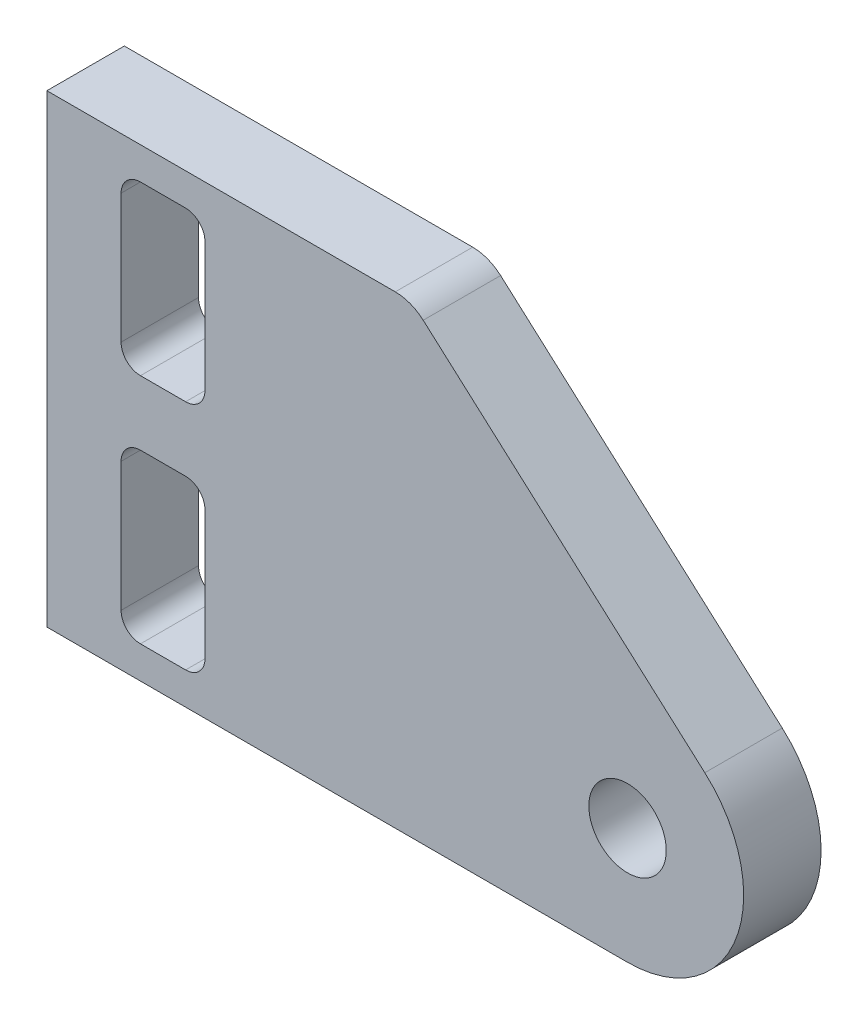
ISO-10303-21;
HEADER;
FILE_DESCRIPTION(('STEP AP214'),'2;1');
FILE_NAME('part.step','',(''),(''),'','','');
FILE_SCHEMA(('AUTOMOTIVE_DESIGN { 1 0 10303 214 1 1 1 1 }'));
ENDSEC;
DATA;
#1=APPLICATION_CONTEXT('core data for automotive mechanical design processes');
#2=APPLICATION_PROTOCOL_DEFINITION('international standard','automotive_design',2000,#1);
#3=PRODUCT_CONTEXT('',#1,'mechanical');
#4=PRODUCT('Part','Part','',(#3));
#5=PRODUCT_RELATED_PRODUCT_CATEGORY('part','',(#4));
#6=PRODUCT_DEFINITION_FORMATION('','',#4);
#7=PRODUCT_DEFINITION_CONTEXT('part definition',#1,'design');
#8=PRODUCT_DEFINITION('design','',#6,#7);
#9=PRODUCT_DEFINITION_SHAPE('','',#8);
#10=(LENGTH_UNIT() NAMED_UNIT(*) SI_UNIT(.MILLI.,.METRE.));
#11=(NAMED_UNIT(*) PLANE_ANGLE_UNIT() SI_UNIT($,.RADIAN.));
#12=(NAMED_UNIT(*) SI_UNIT($,.STERADIAN.) SOLID_ANGLE_UNIT());
#13=UNCERTAINTY_MEASURE_WITH_UNIT(LENGTH_MEASURE(1.E-05),#10,'distance_accuracy_value','');
#14=(GEOMETRIC_REPRESENTATION_CONTEXT(3) GLOBAL_UNCERTAINTY_ASSIGNED_CONTEXT((#13)) GLOBAL_UNIT_ASSIGNED_CONTEXT((#10,
#11,#12)) REPRESENTATION_CONTEXT('',''));
#15=CARTESIAN_POINT('',(0.,0.,0.));
#16=DIRECTION('',(0.,0.,1.));
#17=DIRECTION('',(1.,0.,0.));
#18=AXIS2_PLACEMENT_3D('',#15,#16,#17);
#19=CARTESIAN_POINT('',(201.097853309265,269.1465473352,3.));
#20=DIRECTION('',(0.,0.,1.));
#21=DIRECTION('',(1.,0.,0.));
#22=AXIS2_PLACEMENT_3D('',#19,#20,#21);
#23=PLANE('',#22);
#24=DIRECTION('',(1.,0.,0.));
#25=VECTOR('',#24,1.);
#26=CARTESIAN_POINT('',(182.2228533093,265.8965473352,3.));
#27=LINE('',#26,#25);
#28=CARTESIAN_POINT('',(182.2228533093,265.8965473352,3.));
#29=VERTEX_POINT('',#28);
#30=CARTESIAN_POINT('',(183.9728533093,265.8965473352,3.));
#31=VERTEX_POINT('',#30);
#32=EDGE_CURVE('E249',#29,#31,#27,.T.);
#33=ORIENTED_EDGE('',*,*,#32,.F.);
#34=CARTESIAN_POINT('',(182.2228533093,266.6465473352,3.));
#35=DIRECTION('',(0.,0.,1.));
#36=DIRECTION('',(1.,0.,0.));
#37=AXIS2_PLACEMENT_3D('',#34,#35,#36);
#38=CIRCLE('',#37,0.749999999999987);
#39=CARTESIAN_POINT('',(181.4728533093,266.6465473352,3.));
#40=VERTEX_POINT('',#39);
#41=EDGE_CURVE('E247',#40,#29,#38,.T.);
#42=ORIENTED_EDGE('',*,*,#41,.F.);
#43=DIRECTION('',(0.,-1.,0.));
#44=VECTOR('',#43,1.);
#45=CARTESIAN_POINT('',(181.4728533093,271.6465473352,3.));
#46=LINE('',#45,#44);
#47=CARTESIAN_POINT('',(181.4728533093,271.6465473352,3.));
#48=VERTEX_POINT('',#47);
#49=EDGE_CURVE('E263',#48,#40,#46,.T.);
#50=ORIENTED_EDGE('',*,*,#49,.F.);
#51=CARTESIAN_POINT('',(182.2228533093,271.6465473352,3.));
#52=DIRECTION('',(0.,0.,1.));
#53=DIRECTION('',(1.,0.,0.));
#54=AXIS2_PLACEMENT_3D('',#51,#52,#53);
#55=CIRCLE('',#54,0.750000000000015);
#56=CARTESIAN_POINT('',(182.2228533093,272.3965473352,3.));
#57=VERTEX_POINT('',#56);
#58=EDGE_CURVE('E260',#57,#48,#55,.T.);
#59=ORIENTED_EDGE('',*,*,#58,.F.);
#60=DIRECTION('',(-1.,0.,0.));
#61=VECTOR('',#60,1.);
#62=CARTESIAN_POINT('',(183.9728533093,272.3965473352,3.));
#63=LINE('',#62,#61);
#64=CARTESIAN_POINT('',(183.9728533093,272.3965473352,3.));
#65=VERTEX_POINT('',#64);
#66=EDGE_CURVE('E258',#65,#57,#63,.T.);
#67=ORIENTED_EDGE('',*,*,#66,.F.);
#68=CARTESIAN_POINT('',(183.9728533093,271.6465473352,3.));
#69=DIRECTION('',(0.,0.,1.));
#70=DIRECTION('',(1.,0.,0.));
#71=AXIS2_PLACEMENT_3D('',#68,#69,#70);
#72=CIRCLE('',#71,0.750000000000015);
#73=CARTESIAN_POINT('',(184.7228533093,271.6465473352,3.));
#74=VERTEX_POINT('',#73);
#75=EDGE_CURVE('E256',#74,#65,#72,.T.);
#76=ORIENTED_EDGE('',*,*,#75,.F.);
#77=DIRECTION('',(0.,1.,0.));
#78=VECTOR('',#77,1.);
#79=CARTESIAN_POINT('',(184.7228533093,266.6465473352,3.));
#80=LINE('',#79,#78);
#81=CARTESIAN_POINT('',(184.7228533093,266.6465473352,3.));
#82=VERTEX_POINT('',#81);
#83=EDGE_CURVE('E254',#82,#74,#80,.T.);
#84=ORIENTED_EDGE('',*,*,#83,.F.);
#85=CARTESIAN_POINT('',(183.9728533093,266.6465473352,3.));
#86=DIRECTION('',(0.,0.,1.));
#87=DIRECTION('',(1.,0.,0.));
#88=AXIS2_PLACEMENT_3D('',#85,#86,#87);
#89=CIRCLE('',#88,0.749999999999987);
#90=EDGE_CURVE('E252',#31,#82,#89,.T.);
#91=ORIENTED_EDGE('',*,*,#90,.F.);
#92=EDGE_LOOP('',(#33,#42,#50,#59,#67,#76,#84,#91));
#93=FACE_BOUND('',#92,.T.);
#94=CARTESIAN_POINT('',(201.097853309265,269.1465473352,3.));
#95=DIRECTION('',(0.,0.,1.));
#96=DIRECTION('',(1.,0.,0.));
#97=AXIS2_PLACEMENT_3D('',#94,#95,#96);
#98=CIRCLE('',#97,4.49999999999994);
#99=CARTESIAN_POINT('',(201.0978533093,264.6465473352,3.));
#100=VERTEX_POINT('',#99);
#101=CARTESIAN_POINT('',(204.0923677008,272.5055477161,3.));
#102=VERTEX_POINT('',#101);
#103=EDGE_CURVE('E312',#100,#102,#98,.T.);
#104=ORIENTED_EDGE('',*,*,#103,.T.);
#105=DIRECTION('',(-0.746444529098559,0.665447642552614,0.));
#106=VECTOR('',#105,1.);
#107=CARTESIAN_POINT('',(193.1792057284,282.2345196949,3.));
#108=LINE('',#107,#106);
#109=CARTESIAN_POINT('',(193.1792057284,282.2345196949,3.));
#110=VERTEX_POINT('',#109);
#111=EDGE_CURVE('E315',#102,#110,#108,.T.);
#112=ORIENTED_EDGE('',*,*,#111,.T.);
#113=CARTESIAN_POINT('',(192.097853309156,281.0215473352,3.));
#114=DIRECTION('',(0.,0.,1.));
#115=DIRECTION('',(1.,0.,0.));
#116=AXIS2_PLACEMENT_3D('',#113,#114,#115);
#117=CIRCLE('',#116,1.62499999999999);
#118=CARTESIAN_POINT('',(192.0978533093,282.6465473352,3.));
#119=VERTEX_POINT('',#118);
#120=EDGE_CURVE('E318',#110,#119,#117,.T.);
#121=ORIENTED_EDGE('',*,*,#120,.T.);
#122=DIRECTION('',(-1.,0.,0.));
#123=VECTOR('',#122,1.);
#124=CARTESIAN_POINT('',(192.0978533093,282.6465473352,3.));
#125=LINE('',#124,#123);
#126=CARTESIAN_POINT('',(178.5978533093,282.6465473352,3.));
#127=VERTEX_POINT('',#126);
#128=EDGE_CURVE('E320',#119,#127,#125,.T.);
#129=ORIENTED_EDGE('',*,*,#128,.T.);
#130=DIRECTION('',(0.,-1.,0.));
#131=VECTOR('',#130,1.);
#132=CARTESIAN_POINT('',(178.5978533093,282.6465473352,3.));
#133=LINE('',#132,#131);
#134=CARTESIAN_POINT('',(178.5978533093,264.6465473352,3.));
#135=VERTEX_POINT('',#134);
#136=EDGE_CURVE('E322',#127,#135,#133,.T.);
#137=ORIENTED_EDGE('',*,*,#136,.T.);
#138=DIRECTION('',(1.,0.,0.));
#139=VECTOR('',#138,1.);
#140=CARTESIAN_POINT('',(201.0978533093,264.6465473352,3.));
#141=LINE('',#140,#139);
#142=EDGE_CURVE('E324',#135,#100,#141,.T.);
#143=ORIENTED_EDGE('',*,*,#142,.T.);
#144=EDGE_LOOP('',(#104,#112,#121,#129,#137,#143));
#145=FACE_BOUND('',#144,.T.);
#146=CARTESIAN_POINT('',(201.097853309265,269.1465473352,3.));
#147=DIRECTION('',(0.,0.,1.));
#148=DIRECTION('',(1.,0.,0.));
#149=AXIS2_PLACEMENT_3D('',#146,#147,#148);
#150=CIRCLE('',#149,1.50000000003547);
#151=CARTESIAN_POINT('',(202.5978533093,269.1465473352,3.));
#152=VERTEX_POINT('',#151);
#153=EDGE_CURVE('E306',#152,#152,#150,.T.);
#154=ORIENTED_EDGE('',*,*,#153,.F.);
#155=EDGE_LOOP('',(#154));
#156=FACE_BOUND('',#155,.T.);
#157=DIRECTION('',(1.,0.,0.));
#158=VECTOR('',#157,1.);
#159=CARTESIAN_POINT('',(182.2228533093,274.8959687639,3.));
#160=LINE('',#159,#158);
#161=CARTESIAN_POINT('',(182.2228533093,274.8959687639,3.));
#162=VERTEX_POINT('',#161);
#163=CARTESIAN_POINT('',(183.9728533093,274.8959687639,3.));
#164=VERTEX_POINT('',#163);
#165=EDGE_CURVE('E190',#162,#164,#160,.T.);
#166=ORIENTED_EDGE('',*,*,#165,.F.);
#167=CARTESIAN_POINT('',(182.2228533093,275.6459687639,3.));
#168=DIRECTION('',(0.,0.,1.));
#169=DIRECTION('',(1.,0.,0.));
#170=AXIS2_PLACEMENT_3D('',#167,#168,#169);
#171=CIRCLE('',#170,0.750000000000015);
#172=CARTESIAN_POINT('',(181.4728533093,275.6459687639,3.));
#173=VERTEX_POINT('',#172);
#174=EDGE_CURVE('E182',#173,#162,#171,.T.);
#175=ORIENTED_EDGE('',*,*,#174,.F.);
#176=DIRECTION('',(0.,-1.,0.));
#177=VECTOR('',#176,1.);
#178=CARTESIAN_POINT('',(181.4728533093,280.6459687639,3.));
#179=LINE('',#178,#177);
#180=CARTESIAN_POINT('',(181.4728533093,280.6459687639,3.));
#181=VERTEX_POINT('',#180);
#182=EDGE_CURVE('E215',#181,#173,#179,.T.);
#183=ORIENTED_EDGE('',*,*,#182,.F.);
#184=CARTESIAN_POINT('',(182.2228533093,280.6459687639,3.));
#185=DIRECTION('',(0.,0.,1.));
#186=DIRECTION('',(1.,0.,0.));
#187=AXIS2_PLACEMENT_3D('',#184,#185,#186);
#188=CIRCLE('',#187,0.750000000000015);
#189=CARTESIAN_POINT('',(182.2228533093,281.3959687639,3.));
#190=VERTEX_POINT('',#189);
#191=EDGE_CURVE('E213',#190,#181,#188,.T.);
#192=ORIENTED_EDGE('',*,*,#191,.F.);
#193=DIRECTION('',(-1.,0.,0.));
#194=VECTOR('',#193,1.);
#195=CARTESIAN_POINT('',(183.9728533093,281.3959687639,3.));
#196=LINE('',#195,#194);
#197=CARTESIAN_POINT('',(183.9728533093,281.3959687639,3.));
#198=VERTEX_POINT('',#197);
#199=EDGE_CURVE('E211',#198,#190,#196,.T.);
#200=ORIENTED_EDGE('',*,*,#199,.F.);
#201=CARTESIAN_POINT('',(183.9728533093,280.6459687639,3.));
#202=DIRECTION('',(0.,0.,1.));
#203=DIRECTION('',(1.,0.,0.));
#204=AXIS2_PLACEMENT_3D('',#201,#202,#203);
#205=CIRCLE('',#204,0.750000000000015);
#206=CARTESIAN_POINT('',(184.7228533093,280.6459687639,3.));
#207=VERTEX_POINT('',#206);
#208=EDGE_CURVE('E209',#207,#198,#205,.T.);
#209=ORIENTED_EDGE('',*,*,#208,.F.);
#210=DIRECTION('',(0.,1.,0.));
#211=VECTOR('',#210,1.);
#212=CARTESIAN_POINT('',(184.7228533093,275.6459687639,3.));
#213=LINE('',#212,#211);
#214=CARTESIAN_POINT('',(184.7228533093,275.6459687639,3.));
#215=VERTEX_POINT('',#214);
#216=EDGE_CURVE('E205',#215,#207,#213,.T.);
#217=ORIENTED_EDGE('',*,*,#216,.F.);
#218=CARTESIAN_POINT('',(183.9728533093,275.6459687639,3.));
#219=DIRECTION('',(0.,0.,1.));
#220=DIRECTION('',(1.,0.,0.));
#221=AXIS2_PLACEMENT_3D('',#218,#219,#220);
#222=CIRCLE('',#221,0.750000000000015);
#223=EDGE_CURVE('E203',#164,#215,#222,.T.);
#224=ORIENTED_EDGE('',*,*,#223,.F.);
#225=EDGE_LOOP('',(#166,#175,#183,#192,#200,#209,#217,#224));
#226=FACE_BOUND('',#225,.T.);
#227=ADVANCED_FACE('F33',(#93,#145,#156,#226),#23,.T.);
#228=CARTESIAN_POINT('',(201.097853309265,269.1465473352,0.));
#229=DIRECTION('',(0.,0.,1.));
#230=DIRECTION('',(1.,0.,0.));
#231=AXIS2_PLACEMENT_3D('',#228,#229,#230);
#232=PLANE('',#231);
#233=CARTESIAN_POINT('',(182.2228533093,266.6465473352,0.));
#234=DIRECTION('',(0.,0.,1.));
#235=DIRECTION('',(1.,0.,0.));
#236=AXIS2_PLACEMENT_3D('',#233,#234,#235);
#237=CIRCLE('',#236,0.749999999999987);
#238=CARTESIAN_POINT('',(181.4728533093,266.6465473352,0.));
#239=VERTEX_POINT('',#238);
#240=CARTESIAN_POINT('',(182.2228533093,265.8965473352,0.));
#241=VERTEX_POINT('',#240);
#242=EDGE_CURVE('E198',#239,#241,#237,.T.);
#243=ORIENTED_EDGE('',*,*,#242,.T.);
#244=DIRECTION('',(1.,0.,0.));
#245=VECTOR('',#244,1.);
#246=CARTESIAN_POINT('',(182.2228533093,265.8965473352,0.));
#247=LINE('',#246,#245);
#248=CARTESIAN_POINT('',(183.9728533093,265.8965473352,0.));
#249=VERTEX_POINT('',#248);
#250=EDGE_CURVE('E268',#241,#249,#247,.T.);
#251=ORIENTED_EDGE('',*,*,#250,.T.);
#252=CARTESIAN_POINT('',(183.9728533093,266.6465473352,0.));
#253=DIRECTION('',(0.,0.,1.));
#254=DIRECTION('',(1.,0.,0.));
#255=AXIS2_PLACEMENT_3D('',#252,#253,#254);
#256=CIRCLE('',#255,0.749999999999987);
#257=CARTESIAN_POINT('',(184.7228533093,266.6465473352,0.));
#258=VERTEX_POINT('',#257);
#259=EDGE_CURVE('E271',#249,#258,#256,.T.);
#260=ORIENTED_EDGE('',*,*,#259,.T.);
#261=DIRECTION('',(0.,1.,0.));
#262=VECTOR('',#261,1.);
#263=CARTESIAN_POINT('',(184.7228533093,266.6465473352,0.));
#264=LINE('',#263,#262);
#265=CARTESIAN_POINT('',(184.7228533093,271.6465473352,0.));
#266=VERTEX_POINT('',#265);
#267=EDGE_CURVE('E274',#258,#266,#264,.T.);
#268=ORIENTED_EDGE('',*,*,#267,.T.);
#269=CARTESIAN_POINT('',(183.9728533093,271.6465473352,0.));
#270=DIRECTION('',(0.,0.,1.));
#271=DIRECTION('',(1.,0.,0.));
#272=AXIS2_PLACEMENT_3D('',#269,#270,#271);
#273=CIRCLE('',#272,0.750000000000015);
#274=CARTESIAN_POINT('',(183.9728533093,272.3965473352,0.));
#275=VERTEX_POINT('',#274);
#276=EDGE_CURVE('E277',#266,#275,#273,.T.);
#277=ORIENTED_EDGE('',*,*,#276,.T.);
#278=DIRECTION('',(-1.,0.,0.));
#279=VECTOR('',#278,1.);
#280=CARTESIAN_POINT('',(183.9728533093,272.3965473352,0.));
#281=LINE('',#280,#279);
#282=CARTESIAN_POINT('',(182.2228533093,272.3965473352,0.));
#283=VERTEX_POINT('',#282);
#284=EDGE_CURVE('E280',#275,#283,#281,.T.);
#285=ORIENTED_EDGE('',*,*,#284,.T.);
#286=CARTESIAN_POINT('',(182.2228533093,271.6465473352,0.));
#287=DIRECTION('',(0.,0.,1.));
#288=DIRECTION('',(1.,0.,0.));
#289=AXIS2_PLACEMENT_3D('',#286,#287,#288);
#290=CIRCLE('',#289,0.750000000000015);
#291=CARTESIAN_POINT('',(181.4728533093,271.6465473352,0.));
#292=VERTEX_POINT('',#291);
#293=EDGE_CURVE('E283',#283,#292,#290,.T.);
#294=ORIENTED_EDGE('',*,*,#293,.T.);
#295=DIRECTION('',(0.,-1.,0.));
#296=VECTOR('',#295,1.);
#297=CARTESIAN_POINT('',(181.4728533093,271.6465473352,0.));
#298=LINE('',#297,#296);
#299=EDGE_CURVE('E250',#292,#239,#298,.T.);
#300=ORIENTED_EDGE('',*,*,#299,.T.);
#301=EDGE_LOOP('',(#243,#251,#260,#268,#277,#285,#294,#300));
#302=FACE_BOUND('',#301,.T.);
#303=CARTESIAN_POINT('',(201.097853309265,269.1465473352,0.));
#304=DIRECTION('',(0.,0.,1.));
#305=DIRECTION('',(1.,0.,0.));
#306=AXIS2_PLACEMENT_3D('',#303,#304,#305);
#307=CIRCLE('',#306,4.49999999999994);
#308=CARTESIAN_POINT('',(201.0978533093,264.6465473352,0.));
#309=VERTEX_POINT('',#308);
#310=CARTESIAN_POINT('',(204.0923677008,272.5055477161,0.));
#311=VERTEX_POINT('',#310);
#312=EDGE_CURVE('E309',#309,#311,#307,.T.);
#313=ORIENTED_EDGE('',*,*,#312,.F.);
#314=DIRECTION('',(1.,0.,0.));
#315=VECTOR('',#314,1.);
#316=CARTESIAN_POINT('',(201.0978533093,264.6465473352,0.));
#317=LINE('',#316,#315);
#318=CARTESIAN_POINT('',(178.5978533093,264.6465473352,0.));
#319=VERTEX_POINT('',#318);
#320=EDGE_CURVE('E316',#319,#309,#317,.T.);
#321=ORIENTED_EDGE('',*,*,#320,.F.);
#322=DIRECTION('',(0.,-1.,0.));
#323=VECTOR('',#322,1.);
#324=CARTESIAN_POINT('',(178.5978533093,282.6465473352,0.));
#325=LINE('',#324,#323);
#326=CARTESIAN_POINT('',(178.5978533093,282.6465473352,0.));
#327=VERTEX_POINT('',#326);
#328=EDGE_CURVE('E335',#327,#319,#325,.T.);
#329=ORIENTED_EDGE('',*,*,#328,.F.);
#330=DIRECTION('',(-1.,0.,0.));
#331=VECTOR('',#330,1.);
#332=CARTESIAN_POINT('',(192.0978533093,282.6465473352,0.));
#333=LINE('',#332,#331);
#334=CARTESIAN_POINT('',(192.0978533093,282.6465473352,0.));
#335=VERTEX_POINT('',#334);
#336=EDGE_CURVE('E333',#335,#327,#333,.T.);
#337=ORIENTED_EDGE('',*,*,#336,.F.);
#338=CARTESIAN_POINT('',(192.097853309156,281.0215473352,0.));
#339=DIRECTION('',(0.,0.,1.));
#340=DIRECTION('',(1.,0.,0.));
#341=AXIS2_PLACEMENT_3D('',#338,#339,#340);
#342=CIRCLE('',#341,1.62499999999999);
#343=CARTESIAN_POINT('',(193.1792057284,282.2345196949,0.));
#344=VERTEX_POINT('',#343);
#345=EDGE_CURVE('E331',#344,#335,#342,.T.);
#346=ORIENTED_EDGE('',*,*,#345,.F.);
#347=DIRECTION('',(-0.746444529098559,0.665447642552614,0.));
#348=VECTOR('',#347,1.);
#349=CARTESIAN_POINT('',(193.1792057284,282.2345196949,0.));
#350=LINE('',#349,#348);
#351=EDGE_CURVE('E329',#311,#344,#350,.T.);
#352=ORIENTED_EDGE('',*,*,#351,.F.);
#353=EDGE_LOOP('',(#313,#321,#329,#337,#346,#352));
#354=FACE_BOUND('',#353,.T.);
#355=CARTESIAN_POINT('',(201.097853309265,269.1465473352,0.));
#356=DIRECTION('',(0.,0.,1.));
#357=DIRECTION('',(1.,0.,0.));
#358=AXIS2_PLACEMENT_3D('',#355,#356,#357);
#359=CIRCLE('',#358,1.50000000003547);
#360=CARTESIAN_POINT('',(202.5978533093,269.1465473352,0.));
#361=VERTEX_POINT('',#360);
#362=EDGE_CURVE('E305',#361,#361,#359,.T.);
#363=ORIENTED_EDGE('',*,*,#362,.T.);
#364=EDGE_LOOP('',(#363));
#365=FACE_BOUND('',#364,.T.);
#366=CARTESIAN_POINT('',(182.2228533093,275.6459687639,0.));
#367=DIRECTION('',(0.,0.,1.));
#368=DIRECTION('',(1.,0.,0.));
#369=AXIS2_PLACEMENT_3D('',#366,#367,#368);
#370=CIRCLE('',#369,0.750000000000015);
#371=CARTESIAN_POINT('',(181.4728533093,275.6459687639,0.));
#372=VERTEX_POINT('',#371);
#373=CARTESIAN_POINT('',(182.2228533093,274.8959687639,0.));
#374=VERTEX_POINT('',#373);
#375=EDGE_CURVE('E56',#372,#374,#370,.T.);
#376=ORIENTED_EDGE('',*,*,#375,.T.);
#377=DIRECTION('',(1.,0.,0.));
#378=VECTOR('',#377,1.);
#379=CARTESIAN_POINT('',(182.2228533093,274.8959687639,0.));
#380=LINE('',#379,#378);
#381=CARTESIAN_POINT('',(183.9728533093,274.8959687639,0.));
#382=VERTEX_POINT('',#381);
#383=EDGE_CURVE('E197',#374,#382,#380,.T.);
#384=ORIENTED_EDGE('',*,*,#383,.T.);
#385=CARTESIAN_POINT('',(183.9728533093,275.6459687639,0.));
#386=DIRECTION('',(0.,0.,1.));
#387=DIRECTION('',(1.,0.,0.));
#388=AXIS2_PLACEMENT_3D('',#385,#386,#387);
#389=CIRCLE('',#388,0.750000000000015);
#390=CARTESIAN_POINT('',(184.7228533093,275.6459687639,0.));
#391=VERTEX_POINT('',#390);
#392=EDGE_CURVE('E219',#382,#391,#389,.T.);
#393=ORIENTED_EDGE('',*,*,#392,.T.);
#394=DIRECTION('',(0.,1.,0.));
#395=VECTOR('',#394,1.);
#396=CARTESIAN_POINT('',(184.7228533093,275.6459687639,0.));
#397=LINE('',#396,#395);
#398=CARTESIAN_POINT('',(184.7228533093,280.6459687639,0.));
#399=VERTEX_POINT('',#398);
#400=EDGE_CURVE('E222',#391,#399,#397,.T.);
#401=ORIENTED_EDGE('',*,*,#400,.T.);
#402=CARTESIAN_POINT('',(183.9728533093,280.6459687639,0.));
#403=DIRECTION('',(0.,0.,1.));
#404=DIRECTION('',(1.,0.,0.));
#405=AXIS2_PLACEMENT_3D('',#402,#403,#404);
#406=CIRCLE('',#405,0.750000000000015);
#407=CARTESIAN_POINT('',(183.9728533093,281.3959687639,0.));
#408=VERTEX_POINT('',#407);
#409=EDGE_CURVE('E225',#399,#408,#406,.T.);
#410=ORIENTED_EDGE('',*,*,#409,.T.);
#411=DIRECTION('',(-1.,0.,0.));
#412=VECTOR('',#411,1.);
#413=CARTESIAN_POINT('',(183.9728533093,281.3959687639,0.));
#414=LINE('',#413,#412);
#415=CARTESIAN_POINT('',(182.2228533093,281.3959687639,0.));
#416=VERTEX_POINT('',#415);
#417=EDGE_CURVE('E228',#408,#416,#414,.T.);
#418=ORIENTED_EDGE('',*,*,#417,.T.);
#419=CARTESIAN_POINT('',(182.2228533093,280.6459687639,0.));
#420=DIRECTION('',(0.,0.,1.));
#421=DIRECTION('',(1.,0.,0.));
#422=AXIS2_PLACEMENT_3D('',#419,#420,#421);
#423=CIRCLE('',#422,0.750000000000015);
#424=CARTESIAN_POINT('',(181.4728533093,280.6459687639,0.));
#425=VERTEX_POINT('',#424);
#426=EDGE_CURVE('E231',#416,#425,#423,.T.);
#427=ORIENTED_EDGE('',*,*,#426,.T.);
#428=DIRECTION('',(0.,-1.,0.));
#429=VECTOR('',#428,1.);
#430=CARTESIAN_POINT('',(181.4728533093,280.6459687639,0.));
#431=LINE('',#430,#429);
#432=EDGE_CURVE('E191',#425,#372,#431,.T.);
#433=ORIENTED_EDGE('',*,*,#432,.T.);
#434=EDGE_LOOP('',(#376,#384,#393,#401,#410,#418,#427,#433));
#435=FACE_BOUND('',#434,.T.);
#436=ADVANCED_FACE('F359',(#302,#354,#365,#435),#232,.F.);
#437=CARTESIAN_POINT('',(201.097853309265,269.1465473352,3.));
#438=DIRECTION('',(0.,0.,-1.));
#439=DIRECTION('',(-1.,0.,0.));
#440=AXIS2_PLACEMENT_3D('',#437,#438,#439);
#441=CYLINDRICAL_SURFACE('',#440,4.49999999999994);
#442=ORIENTED_EDGE('',*,*,#312,.T.);
#443=DIRECTION('',(0.,0.,-1.));
#444=VECTOR('',#443,1.);
#445=CARTESIAN_POINT('',(204.0923677008,272.5055477161,3.));
#446=LINE('',#445,#444);
#447=EDGE_CURVE('E11',#102,#311,#446,.T.);
#448=ORIENTED_EDGE('',*,*,#447,.F.);
#449=ORIENTED_EDGE('',*,*,#103,.F.);
#450=DIRECTION('',(0.,0.,-1.));
#451=VECTOR('',#450,1.);
#452=CARTESIAN_POINT('',(201.0978533093,264.6465473352,3.));
#453=LINE('',#452,#451);
#454=EDGE_CURVE('E326',#100,#309,#453,.T.);
#455=ORIENTED_EDGE('',*,*,#454,.T.);
#456=EDGE_LOOP('',(#442,#448,#449,#455));
#457=FACE_BOUND('',#456,.T.);
#458=ADVANCED_FACE('F35',(#457),#441,.T.);
#459=CARTESIAN_POINT('',(193.1792057284,282.2345196949,3.));
#460=DIRECTION('',(-0.665447642552613,-0.746444529098559,0.));
#461=DIRECTION('',(0.746444529098559,-0.665447642552614,0.));
#462=AXIS2_PLACEMENT_3D('',#459,#460,#461);
#463=PLANE('',#462);
#464=ORIENTED_EDGE('',*,*,#351,.T.);
#465=DIRECTION('',(0.,0.,-1.));
#466=VECTOR('',#465,1.);
#467=CARTESIAN_POINT('',(193.1792057284,282.2345196949,3.));
#468=LINE('',#467,#466);
#469=EDGE_CURVE('E41',#110,#344,#468,.T.);
#470=ORIENTED_EDGE('',*,*,#469,.F.);
#471=ORIENTED_EDGE('',*,*,#111,.F.);
#472=ORIENTED_EDGE('',*,*,#447,.T.);
#473=EDGE_LOOP('',(#464,#470,#471,#472));
#474=FACE_BOUND('',#473,.T.);
#475=ADVANCED_FACE('F377',(#474),#463,.F.);
#476=CARTESIAN_POINT('',(192.097853309156,281.0215473352,3.));
#477=DIRECTION('',(0.,0.,-1.));
#478=DIRECTION('',(-1.,0.,0.));
#479=AXIS2_PLACEMENT_3D('',#476,#477,#478);
#480=CYLINDRICAL_SURFACE('',#479,1.62499999999999);
#481=ORIENTED_EDGE('',*,*,#345,.T.);
#482=DIRECTION('',(0.,0.,-1.));
#483=VECTOR('',#482,1.);
#484=CARTESIAN_POINT('',(192.0978533093,282.6465473352,3.));
#485=LINE('',#484,#483);
#486=EDGE_CURVE('E346',#119,#335,#485,.T.);
#487=ORIENTED_EDGE('',*,*,#486,.F.);
#488=ORIENTED_EDGE('',*,*,#120,.F.);
#489=ORIENTED_EDGE('',*,*,#469,.T.);
#490=EDGE_LOOP('',(#481,#487,#488,#489));
#491=FACE_BOUND('',#490,.T.);
#492=ADVANCED_FACE('F353',(#491),#480,.T.);
#493=CARTESIAN_POINT('',(192.0978533093,282.6465473352,3.));
#494=DIRECTION('',(0.,-1.,0.));
#495=DIRECTION('',(0.,0.,-1.));
#496=AXIS2_PLACEMENT_3D('',#493,#494,#495);
#497=PLANE('',#496);
#498=ORIENTED_EDGE('',*,*,#336,.T.);
#499=DIRECTION('',(0.,0.,-1.));
#500=VECTOR('',#499,1.);
#501=CARTESIAN_POINT('',(178.5978533093,282.6465473352,3.));
#502=LINE('',#501,#500);
#503=EDGE_CURVE('E343',#127,#327,#502,.T.);
#504=ORIENTED_EDGE('',*,*,#503,.F.);
#505=ORIENTED_EDGE('',*,*,#128,.F.);
#506=ORIENTED_EDGE('',*,*,#486,.T.);
#507=EDGE_LOOP('',(#498,#504,#505,#506));
#508=FACE_BOUND('',#507,.T.);
#509=ADVANCED_FACE('F365',(#508),#497,.F.);
#510=CARTESIAN_POINT('',(178.5978533093,282.6465473352,3.));
#511=DIRECTION('',(1.,0.,0.));
#512=DIRECTION('',(0.,0.,-1.));
#513=AXIS2_PLACEMENT_3D('',#510,#511,#512);
#514=PLANE('',#513);
#515=ORIENTED_EDGE('',*,*,#328,.T.);
#516=DIRECTION('',(0.,0.,-1.));
#517=VECTOR('',#516,1.);
#518=CARTESIAN_POINT('',(178.5978533093,264.6465473352,3.));
#519=LINE('',#518,#517);
#520=EDGE_CURVE('E340',#135,#319,#519,.T.);
#521=ORIENTED_EDGE('',*,*,#520,.F.);
#522=ORIENTED_EDGE('',*,*,#136,.F.);
#523=ORIENTED_EDGE('',*,*,#503,.T.);
#524=EDGE_LOOP('',(#515,#521,#522,#523));
#525=FACE_BOUND('',#524,.T.);
#526=ADVANCED_FACE('F369',(#525),#514,.F.);
#527=CARTESIAN_POINT('',(201.0978533093,264.6465473352,3.));
#528=DIRECTION('',(0.,1.,0.));
#529=DIRECTION('',(0.,0.,1.));
#530=AXIS2_PLACEMENT_3D('',#527,#528,#529);
#531=PLANE('',#530);
#532=ORIENTED_EDGE('',*,*,#320,.T.);
#533=ORIENTED_EDGE('',*,*,#454,.F.);
#534=ORIENTED_EDGE('',*,*,#142,.F.);
#535=ORIENTED_EDGE('',*,*,#520,.T.);
#536=EDGE_LOOP('',(#532,#533,#534,#535));
#537=FACE_BOUND('',#536,.T.);
#538=ADVANCED_FACE('F380',(#537),#531,.F.);
#539=CARTESIAN_POINT('',(201.097853309265,269.1465473352,3.));
#540=DIRECTION('',(0.,0.,-1.));
#541=DIRECTION('',(-1.,0.,0.));
#542=AXIS2_PLACEMENT_3D('',#539,#540,#541);
#543=CYLINDRICAL_SURFACE('',#542,1.50000000003547);
#544=ORIENTED_EDGE('',*,*,#153,.T.);
#545=EDGE_LOOP('',(#544));
#546=FACE_BOUND('',#545,.T.);
#547=ORIENTED_EDGE('',*,*,#362,.F.);
#548=EDGE_LOOP('',(#547));
#549=FACE_BOUND('',#548,.T.);
#550=ADVANCED_FACE('F382',(#546,#549),#543,.F.);
#551=CARTESIAN_POINT('',(182.2228533093,266.6465473352,3.));
#552=DIRECTION('',(0.,0.,-1.));
#553=DIRECTION('',(-1.,0.,0.));
#554=AXIS2_PLACEMENT_3D('',#551,#552,#553);
#555=CYLINDRICAL_SURFACE('',#554,0.749999999999987);
#556=ORIENTED_EDGE('',*,*,#242,.F.);
#557=DIRECTION('',(0.,0.,-1.));
#558=VECTOR('',#557,1.);
#559=CARTESIAN_POINT('',(181.4728533093,266.6465473352,3.));
#560=LINE('',#559,#558);
#561=EDGE_CURVE('E265',#40,#239,#560,.T.);
#562=ORIENTED_EDGE('',*,*,#561,.F.);
#563=ORIENTED_EDGE('',*,*,#41,.T.);
#564=DIRECTION('',(0.,0.,-1.));
#565=VECTOR('',#564,1.);
#566=CARTESIAN_POINT('',(182.2228533093,265.8965473352,3.));
#567=LINE('',#566,#565);
#568=EDGE_CURVE('E302',#29,#241,#567,.T.);
#569=ORIENTED_EDGE('',*,*,#568,.T.);
#570=EDGE_LOOP('',(#556,#562,#563,#569));
#571=FACE_BOUND('',#570,.T.);
#572=ADVANCED_FACE('F388',(#571),#555,.F.);
#573=CARTESIAN_POINT('',(182.2228533093,265.8965473352,3.));
#574=DIRECTION('',(0.,1.,0.));
#575=DIRECTION('',(0.,0.,1.));
#576=AXIS2_PLACEMENT_3D('',#573,#574,#575);
#577=PLANE('',#576);
#578=ORIENTED_EDGE('',*,*,#250,.F.);
#579=ORIENTED_EDGE('',*,*,#568,.F.);
#580=ORIENTED_EDGE('',*,*,#32,.T.);
#581=DIRECTION('',(0.,0.,-1.));
#582=VECTOR('',#581,1.);
#583=CARTESIAN_POINT('',(183.9728533093,265.8965473352,3.));
#584=LINE('',#583,#582);
#585=EDGE_CURVE('E300',#31,#249,#584,.T.);
#586=ORIENTED_EDGE('',*,*,#585,.T.);
#587=EDGE_LOOP('',(#578,#579,#580,#586));
#588=FACE_BOUND('',#587,.T.);
#589=ADVANCED_FACE('F404',(#588),#577,.T.);
#590=CARTESIAN_POINT('',(183.9728533093,266.6465473352,3.));
#591=DIRECTION('',(0.,0.,-1.));
#592=DIRECTION('',(-1.,0.,0.));
#593=AXIS2_PLACEMENT_3D('',#590,#591,#592);
#594=CYLINDRICAL_SURFACE('',#593,0.749999999999987);
#595=ORIENTED_EDGE('',*,*,#259,.F.);
#596=ORIENTED_EDGE('',*,*,#585,.F.);
#597=ORIENTED_EDGE('',*,*,#90,.T.);
#598=DIRECTION('',(0.,0.,-1.));
#599=VECTOR('',#598,1.);
#600=CARTESIAN_POINT('',(184.7228533093,266.6465473352,3.));
#601=LINE('',#600,#599);
#602=EDGE_CURVE('E298',#82,#258,#601,.T.);
#603=ORIENTED_EDGE('',*,*,#602,.T.);
#604=EDGE_LOOP('',(#595,#596,#597,#603));
#605=FACE_BOUND('',#604,.T.);
#606=ADVANCED_FACE('F408',(#605),#594,.F.);
#607=CARTESIAN_POINT('',(184.7228533093,266.6465473352,3.));
#608=DIRECTION('',(-1.,0.,0.));
#609=DIRECTION('',(0.,0.,1.));
#610=AXIS2_PLACEMENT_3D('',#607,#608,#609);
#611=PLANE('',#610);
#612=ORIENTED_EDGE('',*,*,#267,.F.);
#613=ORIENTED_EDGE('',*,*,#602,.F.);
#614=ORIENTED_EDGE('',*,*,#83,.T.);
#615=DIRECTION('',(0.,0.,-1.));
#616=VECTOR('',#615,1.);
#617=CARTESIAN_POINT('',(184.7228533093,271.6465473352,3.));
#618=LINE('',#617,#616);
#619=EDGE_CURVE('E296',#74,#266,#618,.T.);
#620=ORIENTED_EDGE('',*,*,#619,.T.);
#621=EDGE_LOOP('',(#612,#613,#614,#620));
#622=FACE_BOUND('',#621,.T.);
#623=ADVANCED_FACE('F412',(#622),#611,.T.);
#624=CARTESIAN_POINT('',(183.9728533093,271.6465473352,3.));
#625=DIRECTION('',(0.,0.,-1.));
#626=DIRECTION('',(-1.,0.,0.));
#627=AXIS2_PLACEMENT_3D('',#624,#625,#626);
#628=CYLINDRICAL_SURFACE('',#627,0.750000000000015);
#629=ORIENTED_EDGE('',*,*,#276,.F.);
#630=ORIENTED_EDGE('',*,*,#619,.F.);
#631=ORIENTED_EDGE('',*,*,#75,.T.);
#632=DIRECTION('',(0.,0.,-1.));
#633=VECTOR('',#632,1.);
#634=CARTESIAN_POINT('',(183.9728533093,272.3965473352,3.));
#635=LINE('',#634,#633);
#636=EDGE_CURVE('E294',#65,#275,#635,.T.);
#637=ORIENTED_EDGE('',*,*,#636,.T.);
#638=EDGE_LOOP('',(#629,#630,#631,#637));
#639=FACE_BOUND('',#638,.T.);
#640=ADVANCED_FACE('F416',(#639),#628,.F.);
#641=CARTESIAN_POINT('',(183.9728533093,272.3965473352,3.));
#642=DIRECTION('',(0.,-1.,0.));
#643=DIRECTION('',(0.,0.,-1.));
#644=AXIS2_PLACEMENT_3D('',#641,#642,#643);
#645=PLANE('',#644);
#646=ORIENTED_EDGE('',*,*,#284,.F.);
#647=ORIENTED_EDGE('',*,*,#636,.F.);
#648=ORIENTED_EDGE('',*,*,#66,.T.);
#649=DIRECTION('',(0.,0.,-1.));
#650=VECTOR('',#649,1.);
#651=CARTESIAN_POINT('',(182.2228533093,272.3965473352,3.));
#652=LINE('',#651,#650);
#653=EDGE_CURVE('E292',#57,#283,#652,.T.);
#654=ORIENTED_EDGE('',*,*,#653,.T.);
#655=EDGE_LOOP('',(#646,#647,#648,#654));
#656=FACE_BOUND('',#655,.T.);
#657=ADVANCED_FACE('F420',(#656),#645,.T.);
#658=CARTESIAN_POINT('',(182.2228533093,271.6465473352,3.));
#659=DIRECTION('',(0.,0.,-1.));
#660=DIRECTION('',(-1.,0.,0.));
#661=AXIS2_PLACEMENT_3D('',#658,#659,#660);
#662=CYLINDRICAL_SURFACE('',#661,0.750000000000015);
#663=ORIENTED_EDGE('',*,*,#293,.F.);
#664=ORIENTED_EDGE('',*,*,#653,.F.);
#665=ORIENTED_EDGE('',*,*,#58,.T.);
#666=DIRECTION('',(0.,0.,-1.));
#667=VECTOR('',#666,1.);
#668=CARTESIAN_POINT('',(181.4728533093,271.6465473352,3.));
#669=LINE('',#668,#667);
#670=EDGE_CURVE('E290',#48,#292,#669,.T.);
#671=ORIENTED_EDGE('',*,*,#670,.T.);
#672=EDGE_LOOP('',(#663,#664,#665,#671));
#673=FACE_BOUND('',#672,.T.);
#674=ADVANCED_FACE('F424',(#673),#662,.F.);
#675=CARTESIAN_POINT('',(181.4728533093,271.6465473352,3.));
#676=DIRECTION('',(1.,0.,0.));
#677=DIRECTION('',(0.,0.,-1.));
#678=AXIS2_PLACEMENT_3D('',#675,#676,#677);
#679=PLANE('',#678);
#680=ORIENTED_EDGE('',*,*,#299,.F.);
#681=ORIENTED_EDGE('',*,*,#670,.F.);
#682=ORIENTED_EDGE('',*,*,#49,.T.);
#683=ORIENTED_EDGE('',*,*,#561,.T.);
#684=EDGE_LOOP('',(#680,#681,#682,#683));
#685=FACE_BOUND('',#684,.T.);
#686=ADVANCED_FACE('F428',(#685),#679,.T.);
#687=CARTESIAN_POINT('',(182.2228533093,275.6459687639,3.));
#688=DIRECTION('',(0.,0.,-1.));
#689=DIRECTION('',(-1.,0.,0.));
#690=AXIS2_PLACEMENT_3D('',#687,#688,#689);
#691=CYLINDRICAL_SURFACE('',#690,0.750000000000015);
#692=ORIENTED_EDGE('',*,*,#375,.F.);
#693=DIRECTION('',(0.,0.,-1.));
#694=VECTOR('',#693,1.);
#695=CARTESIAN_POINT('',(181.4728533093,275.6459687639,3.));
#696=LINE('',#695,#694);
#697=EDGE_CURVE('E186',#173,#372,#696,.T.);
#698=ORIENTED_EDGE('',*,*,#697,.F.);
#699=ORIENTED_EDGE('',*,*,#174,.T.);
#700=DIRECTION('',(0.,0.,-1.));
#701=VECTOR('',#700,1.);
#702=CARTESIAN_POINT('',(182.2228533093,274.8959687639,3.));
#703=LINE('',#702,#701);
#704=EDGE_CURVE('E185',#162,#374,#703,.T.);
#705=ORIENTED_EDGE('',*,*,#704,.T.);
#706=EDGE_LOOP('',(#692,#698,#699,#705));
#707=FACE_BOUND('',#706,.T.);
#708=ADVANCED_FACE('F184',(#707),#691,.F.);
#709=CARTESIAN_POINT('',(182.2228533093,274.8959687639,3.));
#710=DIRECTION('',(0.,1.,0.));
#711=DIRECTION('',(0.,0.,1.));
#712=AXIS2_PLACEMENT_3D('',#709,#710,#711);
#713=PLANE('',#712);
#714=ORIENTED_EDGE('',*,*,#383,.F.);
#715=ORIENTED_EDGE('',*,*,#704,.F.);
#716=ORIENTED_EDGE('',*,*,#165,.T.);
#717=DIRECTION('',(0.,0.,-1.));
#718=VECTOR('',#717,1.);
#719=CARTESIAN_POINT('',(183.9728533093,274.8959687639,3.));
#720=LINE('',#719,#718);
#721=EDGE_CURVE('E199',#164,#382,#720,.T.);
#722=ORIENTED_EDGE('',*,*,#721,.T.);
#723=EDGE_LOOP('',(#714,#715,#716,#722));
#724=FACE_BOUND('',#723,.T.);
#725=ADVANCED_FACE('F194',(#724),#713,.T.);
#726=CARTESIAN_POINT('',(183.9728533093,275.6459687639,3.));
#727=DIRECTION('',(0.,0.,-1.));
#728=DIRECTION('',(-1.,0.,0.));
#729=AXIS2_PLACEMENT_3D('',#726,#727,#728);
#730=CYLINDRICAL_SURFACE('',#729,0.750000000000015);
#731=ORIENTED_EDGE('',*,*,#392,.F.);
#732=ORIENTED_EDGE('',*,*,#721,.F.);
#733=ORIENTED_EDGE('',*,*,#223,.T.);
#734=DIRECTION('',(0.,0.,-1.));
#735=VECTOR('',#734,1.);
#736=CARTESIAN_POINT('',(184.7228533093,275.6459687639,3.));
#737=LINE('',#736,#735);
#738=EDGE_CURVE('E244',#215,#391,#737,.T.);
#739=ORIENTED_EDGE('',*,*,#738,.T.);
#740=EDGE_LOOP('',(#731,#732,#733,#739));
#741=FACE_BOUND('',#740,.T.);
#742=ADVANCED_FACE('F437',(#741),#730,.F.);
#743=CARTESIAN_POINT('',(184.7228533093,275.6459687639,3.));
#744=DIRECTION('',(-1.,0.,0.));
#745=DIRECTION('',(0.,0.,1.));
#746=AXIS2_PLACEMENT_3D('',#743,#744,#745);
#747=PLANE('',#746);
#748=ORIENTED_EDGE('',*,*,#400,.F.);
#749=ORIENTED_EDGE('',*,*,#738,.F.);
#750=ORIENTED_EDGE('',*,*,#216,.T.);
#751=DIRECTION('',(0.,0.,-1.));
#752=VECTOR('',#751,1.);
#753=CARTESIAN_POINT('',(184.7228533093,280.6459687639,3.));
#754=LINE('',#753,#752);
#755=EDGE_CURVE('E242',#207,#399,#754,.T.);
#756=ORIENTED_EDGE('',*,*,#755,.T.);
#757=EDGE_LOOP('',(#748,#749,#750,#756));
#758=FACE_BOUND('',#757,.T.);
#759=ADVANCED_FACE('F440',(#758),#747,.T.);
#760=CARTESIAN_POINT('',(183.9728533093,280.6459687639,3.));
#761=DIRECTION('',(0.,0.,-1.));
#762=DIRECTION('',(-1.,0.,0.));
#763=AXIS2_PLACEMENT_3D('',#760,#761,#762);
#764=CYLINDRICAL_SURFACE('',#763,0.750000000000015);
#765=ORIENTED_EDGE('',*,*,#409,.F.);
#766=ORIENTED_EDGE('',*,*,#755,.F.);
#767=ORIENTED_EDGE('',*,*,#208,.T.);
#768=DIRECTION('',(0.,0.,-1.));
#769=VECTOR('',#768,1.);
#770=CARTESIAN_POINT('',(183.9728533093,281.3959687639,3.));
#771=LINE('',#770,#769);
#772=EDGE_CURVE('E240',#198,#408,#771,.T.);
#773=ORIENTED_EDGE('',*,*,#772,.T.);
#774=EDGE_LOOP('',(#765,#766,#767,#773));
#775=FACE_BOUND('',#774,.T.);
#776=ADVANCED_FACE('F444',(#775),#764,.F.);
#777=CARTESIAN_POINT('',(183.9728533093,281.3959687639,3.));
#778=DIRECTION('',(0.,-1.,0.));
#779=DIRECTION('',(0.,0.,-1.));
#780=AXIS2_PLACEMENT_3D('',#777,#778,#779);
#781=PLANE('',#780);
#782=ORIENTED_EDGE('',*,*,#417,.F.);
#783=ORIENTED_EDGE('',*,*,#772,.F.);
#784=ORIENTED_EDGE('',*,*,#199,.T.);
#785=DIRECTION('',(0.,0.,-1.));
#786=VECTOR('',#785,1.);
#787=CARTESIAN_POINT('',(182.2228533093,281.3959687639,3.));
#788=LINE('',#787,#786);
#789=EDGE_CURVE('E238',#190,#416,#788,.T.);
#790=ORIENTED_EDGE('',*,*,#789,.T.);
#791=EDGE_LOOP('',(#782,#783,#784,#790));
#792=FACE_BOUND('',#791,.T.);
#793=ADVANCED_FACE('F448',(#792),#781,.T.);
#794=CARTESIAN_POINT('',(182.2228533093,280.6459687639,3.));
#795=DIRECTION('',(0.,0.,-1.));
#796=DIRECTION('',(-1.,0.,0.));
#797=AXIS2_PLACEMENT_3D('',#794,#795,#796);
#798=CYLINDRICAL_SURFACE('',#797,0.750000000000015);
#799=ORIENTED_EDGE('',*,*,#426,.F.);
#800=ORIENTED_EDGE('',*,*,#789,.F.);
#801=ORIENTED_EDGE('',*,*,#191,.T.);
#802=DIRECTION('',(0.,0.,-1.));
#803=VECTOR('',#802,1.);
#804=CARTESIAN_POINT('',(181.4728533093,280.6459687639,3.));
#805=LINE('',#804,#803);
#806=EDGE_CURVE('E48',#181,#425,#805,.T.);
#807=ORIENTED_EDGE('',*,*,#806,.T.);
#808=EDGE_LOOP('',(#799,#800,#801,#807));
#809=FACE_BOUND('',#808,.T.);
#810=ADVANCED_FACE('F452',(#809),#798,.F.);
#811=CARTESIAN_POINT('',(181.4728533093,280.6459687639,3.));
#812=DIRECTION('',(1.,0.,0.));
#813=DIRECTION('',(0.,0.,-1.));
#814=AXIS2_PLACEMENT_3D('',#811,#812,#813);
#815=PLANE('',#814);
#816=ORIENTED_EDGE('',*,*,#432,.F.);
#817=ORIENTED_EDGE('',*,*,#806,.F.);
#818=ORIENTED_EDGE('',*,*,#182,.T.);
#819=ORIENTED_EDGE('',*,*,#697,.T.);
#820=EDGE_LOOP('',(#816,#817,#818,#819));
#821=FACE_BOUND('',#820,.T.);
#822=ADVANCED_FACE('F456',(#821),#815,.T.);
#823=CLOSED_SHELL('',(#227,#436,#458,#475,#492,#509,#526,#538,#550,#572,#589,#606,#623,#640,
#657,#674,#686,#708,#725,#742,#759,#776,#793,#810,#822));
#824=MANIFOLD_SOLID_BREP('B2',#823);
#825=ADVANCED_BREP_SHAPE_REPRESENTATION('',(#18,#824),#14);
#826=SHAPE_DEFINITION_REPRESENTATION(#9,#825);
ENDSEC;
END-ISO-10303-21;
